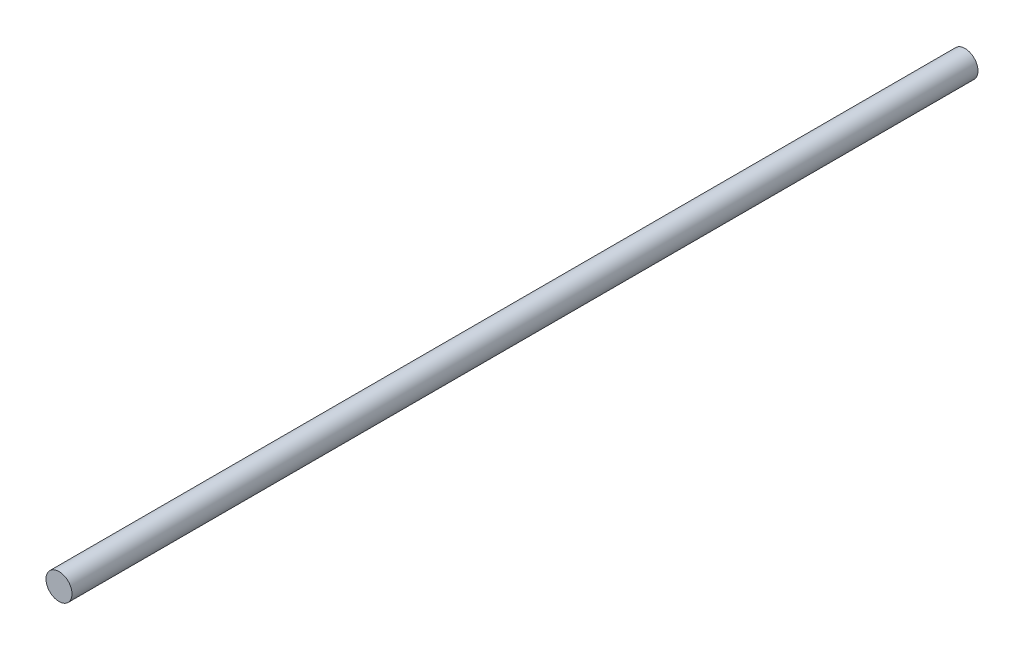
ISO-10303-21;
HEADER;
FILE_DESCRIPTION(('STEP AP214'),'2;1');
FILE_NAME('part.step','',(''),(''),'','','');
FILE_SCHEMA(('AUTOMOTIVE_DESIGN { 1 0 10303 214 1 1 1 1 }'));
ENDSEC;
DATA;
#1=APPLICATION_CONTEXT('core data for automotive mechanical design processes');
#2=APPLICATION_PROTOCOL_DEFINITION('international standard','automotive_design',2000,#1);
#3=PRODUCT_CONTEXT('',#1,'mechanical');
#4=PRODUCT('Part','Part','',(#3));
#5=PRODUCT_RELATED_PRODUCT_CATEGORY('part','',(#4));
#6=PRODUCT_DEFINITION_FORMATION('','',#4);
#7=PRODUCT_DEFINITION_CONTEXT('part definition',#1,'design');
#8=PRODUCT_DEFINITION('design','',#6,#7);
#9=PRODUCT_DEFINITION_SHAPE('','',#8);
#10=(LENGTH_UNIT() NAMED_UNIT(*) SI_UNIT(.MILLI.,.METRE.));
#11=(NAMED_UNIT(*) PLANE_ANGLE_UNIT() SI_UNIT($,.RADIAN.));
#12=(NAMED_UNIT(*) SI_UNIT($,.STERADIAN.) SOLID_ANGLE_UNIT());
#13=UNCERTAINTY_MEASURE_WITH_UNIT(LENGTH_MEASURE(1.E-05),#10,'distance_accuracy_value','');
#14=(GEOMETRIC_REPRESENTATION_CONTEXT(3) GLOBAL_UNCERTAINTY_ASSIGNED_CONTEXT((#13)) GLOBAL_UNIT_ASSIGNED_CONTEXT((#10,
#11,#12)) REPRESENTATION_CONTEXT('',''));
#15=CARTESIAN_POINT('',(0.,0.,0.));
#16=DIRECTION('',(0.,0.,1.));
#17=DIRECTION('',(1.,0.,0.));
#18=AXIS2_PLACEMENT_3D('',#15,#16,#17);
#19=CARTESIAN_POINT('',(0.,0.,220.98));
#20=DIRECTION('',(0.,0.,-1.));
#21=DIRECTION('',(-1.,0.,0.));
#22=AXIS2_PLACEMENT_3D('',#19,#20,#21);
#23=CYLINDRICAL_SURFACE('',#22,3.175);
#24=CARTESIAN_POINT('',(0.,0.,220.98));
#25=DIRECTION('',(0.,0.,1.));
#26=DIRECTION('',(1.,0.,0.));
#27=AXIS2_PLACEMENT_3D('',#24,#25,#26);
#28=CIRCLE('',#27,3.175);
#29=CARTESIAN_POINT('',(3.175,0.,220.98));
#30=VERTEX_POINT('',#29);
#31=EDGE_CURVE('E10',#30,#30,#28,.T.);
#32=ORIENTED_EDGE('',*,*,#31,.F.);
#33=EDGE_LOOP('',(#32));
#34=FACE_BOUND('',#33,.T.);
#35=CARTESIAN_POINT('',(0.,0.,0.));
#36=DIRECTION('',(0.,0.,1.));
#37=DIRECTION('',(1.,0.,0.));
#38=AXIS2_PLACEMENT_3D('',#35,#36,#37);
#39=CIRCLE('',#38,3.175);
#40=CARTESIAN_POINT('',(3.175,0.,0.));
#41=VERTEX_POINT('',#40);
#42=EDGE_CURVE('E34',#41,#41,#39,.T.);
#43=ORIENTED_EDGE('',*,*,#42,.T.);
#44=EDGE_LOOP('',(#43));
#45=FACE_BOUND('',#44,.T.);
#46=ADVANCED_FACE('F31',(#34,#45),#23,.T.);
#47=CARTESIAN_POINT('',(0.,0.,220.98));
#48=DIRECTION('',(0.,0.,1.));
#49=DIRECTION('',(1.,0.,0.));
#50=AXIS2_PLACEMENT_3D('',#47,#48,#49);
#51=PLANE('',#50);
#52=ORIENTED_EDGE('',*,*,#31,.T.);
#53=EDGE_LOOP('',(#52));
#54=FACE_BOUND('',#53,.T.);
#55=ADVANCED_FACE('F46',(#54),#51,.T.);
#56=CARTESIAN_POINT('',(0.,0.,0.));
#57=DIRECTION('',(0.,0.,1.));
#58=DIRECTION('',(1.,0.,0.));
#59=AXIS2_PLACEMENT_3D('',#56,#57,#58);
#60=PLANE('',#59);
#61=ORIENTED_EDGE('',*,*,#42,.F.);
#62=EDGE_LOOP('',(#61));
#63=FACE_BOUND('',#62,.T.);
#64=ADVANCED_FACE('F44',(#63),#60,.F.);
#65=CLOSED_SHELL('',(#46,#55,#64));
#66=MANIFOLD_SOLID_BREP('B2',#65);
#67=ADVANCED_BREP_SHAPE_REPRESENTATION('',(#18,#66),#14);
#68=SHAPE_DEFINITION_REPRESENTATION(#9,#67);
ENDSEC;
END-ISO-10303-21;
